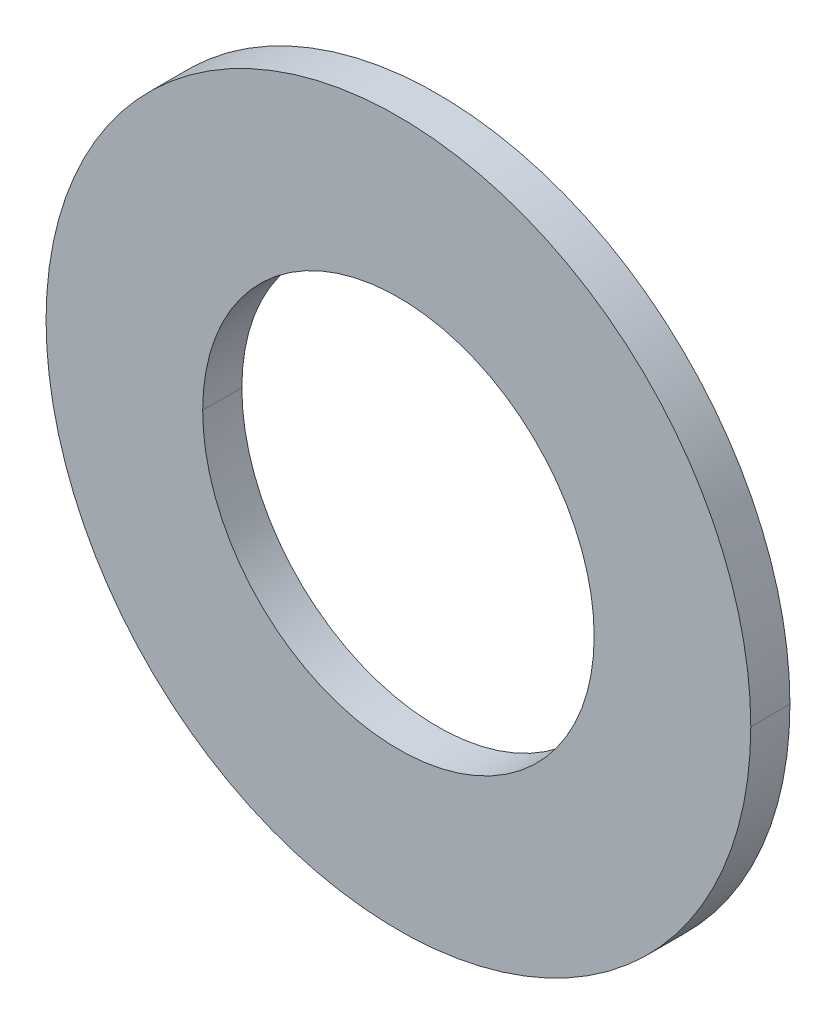
ISO-10303-21;
HEADER;
FILE_DESCRIPTION(('STEP AP214'),'2;1');
FILE_NAME('part.step','',(''),(''),'','','');
FILE_SCHEMA(('AUTOMOTIVE_DESIGN { 1 0 10303 214 1 1 1 1 }'));
ENDSEC;
DATA;
#1=APPLICATION_CONTEXT('core data for automotive mechanical design processes');
#2=APPLICATION_PROTOCOL_DEFINITION('international standard','automotive_design',2000,#1);
#3=PRODUCT_CONTEXT('',#1,'mechanical');
#4=PRODUCT('Part','Part','',(#3));
#5=PRODUCT_RELATED_PRODUCT_CATEGORY('part','',(#4));
#6=PRODUCT_DEFINITION_FORMATION('','',#4);
#7=PRODUCT_DEFINITION_CONTEXT('part definition',#1,'design');
#8=PRODUCT_DEFINITION('design','',#6,#7);
#9=PRODUCT_DEFINITION_SHAPE('','',#8);
#10=(LENGTH_UNIT() NAMED_UNIT(*) SI_UNIT(.MILLI.,.METRE.));
#11=(NAMED_UNIT(*) PLANE_ANGLE_UNIT() SI_UNIT($,.RADIAN.));
#12=(NAMED_UNIT(*) SI_UNIT($,.STERADIAN.) SOLID_ANGLE_UNIT());
#13=UNCERTAINTY_MEASURE_WITH_UNIT(LENGTH_MEASURE(1.E-05),#10,'distance_accuracy_value','');
#14=(GEOMETRIC_REPRESENTATION_CONTEXT(3) GLOBAL_UNCERTAINTY_ASSIGNED_CONTEXT((#13)) GLOBAL_UNIT_ASSIGNED_CONTEXT((#10,
#11,#12)) REPRESENTATION_CONTEXT('',''));
#15=CARTESIAN_POINT('',(0.,0.,0.));
#16=DIRECTION('',(0.,0.,1.));
#17=DIRECTION('',(1.,0.,0.));
#18=AXIS2_PLACEMENT_3D('',#15,#16,#17);
#19=CARTESIAN_POINT('',(0.,0.,0.25));
#20=DIRECTION('',(0.,0.,-1.));
#21=DIRECTION('',(-1.,0.,0.));
#22=AXIS2_PLACEMENT_3D('',#19,#20,#21);
#23=CYLINDRICAL_SURFACE('',#22,2.5);
#24=CARTESIAN_POINT('',(0.,0.,0.25));
#25=DIRECTION('',(0.,0.,1.));
#26=DIRECTION('',(1.,0.,0.));
#27=AXIS2_PLACEMENT_3D('',#24,#25,#26);
#28=CIRCLE('',#27,2.5);
#29=CARTESIAN_POINT('',(-2.5,0.,0.25));
#30=VERTEX_POINT('',#29);
#31=CARTESIAN_POINT('',(2.5,0.,0.25));
#32=VERTEX_POINT('',#31);
#33=EDGE_CURVE('E11',#30,#32,#28,.T.);
#34=ORIENTED_EDGE('',*,*,#33,.T.);
#35=DIRECTION('',(0.,0.,-1.));
#36=VECTOR('',#35,1.);
#37=CARTESIAN_POINT('',(2.5,0.,0.25));
#38=LINE('',#37,#36);
#39=CARTESIAN_POINT('',(2.5,0.,-0.25));
#40=VERTEX_POINT('',#39);
#41=EDGE_CURVE('E28',#32,#40,#38,.T.);
#42=ORIENTED_EDGE('',*,*,#41,.T.);
#43=CARTESIAN_POINT('',(0.,0.,-0.25));
#44=DIRECTION('',(0.,0.,1.));
#45=DIRECTION('',(1.,0.,0.));
#46=AXIS2_PLACEMENT_3D('',#43,#44,#45);
#47=CIRCLE('',#46,2.5);
#48=CARTESIAN_POINT('',(-2.5,0.,-0.25));
#49=VERTEX_POINT('',#48);
#50=EDGE_CURVE('E21',#49,#40,#47,.T.);
#51=ORIENTED_EDGE('',*,*,#50,.F.);
#52=DIRECTION('',(0.,0.,-1.));
#53=VECTOR('',#52,1.);
#54=CARTESIAN_POINT('',(-2.5,0.,0.25));
#55=LINE('',#54,#53);
#56=EDGE_CURVE('E69',#30,#49,#55,.T.);
#57=ORIENTED_EDGE('',*,*,#56,.F.);
#58=EDGE_LOOP('',(#34,#42,#51,#57));
#59=FACE_BOUND('',#58,.T.);
#60=ADVANCED_FACE('F17',(#59),#23,.F.);
#61=CARTESIAN_POINT('',(0.,0.,0.25));
#62=DIRECTION('',(0.,0.,-1.));
#63=DIRECTION('',(-1.,0.,0.));
#64=AXIS2_PLACEMENT_3D('',#61,#62,#63);
#65=CYLINDRICAL_SURFACE('',#64,4.5);
#66=CARTESIAN_POINT('',(0.,0.,0.25));
#67=DIRECTION('',(0.,0.,1.));
#68=DIRECTION('',(1.,0.,0.));
#69=AXIS2_PLACEMENT_3D('',#66,#67,#68);
#70=CIRCLE('',#69,4.5);
#71=CARTESIAN_POINT('',(4.5,0.,0.25));
#72=VERTEX_POINT('',#71);
#73=CARTESIAN_POINT('',(-4.5,0.,0.25));
#74=VERTEX_POINT('',#73);
#75=EDGE_CURVE('E98',#72,#74,#70,.T.);
#76=ORIENTED_EDGE('',*,*,#75,.F.);
#77=DIRECTION('',(0.,0.,-1.));
#78=VECTOR('',#77,1.);
#79=CARTESIAN_POINT('',(4.5,0.,0.25));
#80=LINE('',#79,#78);
#81=CARTESIAN_POINT('',(4.5,0.,-0.25));
#82=VERTEX_POINT('',#81);
#83=EDGE_CURVE('E95',#72,#82,#80,.T.);
#84=ORIENTED_EDGE('',*,*,#83,.T.);
#85=CARTESIAN_POINT('',(0.,0.,-0.25));
#86=DIRECTION('',(0.,0.,1.));
#87=DIRECTION('',(1.,0.,0.));
#88=AXIS2_PLACEMENT_3D('',#85,#86,#87);
#89=CIRCLE('',#88,4.5);
#90=CARTESIAN_POINT('',(-4.5,0.,-0.25));
#91=VERTEX_POINT('',#90);
#92=EDGE_CURVE('E92',#82,#91,#89,.T.);
#93=ORIENTED_EDGE('',*,*,#92,.T.);
#94=DIRECTION('',(0.,0.,-1.));
#95=VECTOR('',#94,1.);
#96=CARTESIAN_POINT('',(-4.5,0.,0.25));
#97=LINE('',#96,#95);
#98=EDGE_CURVE('E86',#74,#91,#97,.T.);
#99=ORIENTED_EDGE('',*,*,#98,.F.);
#100=EDGE_LOOP('',(#76,#84,#93,#99));
#101=FACE_BOUND('',#100,.T.);
#102=ADVANCED_FACE('F115',(#101),#65,.T.);
#103=CARTESIAN_POINT('',(0.,0.,0.25));
#104=DIRECTION('',(0.,0.,1.));
#105=DIRECTION('',(1.,0.,0.));
#106=AXIS2_PLACEMENT_3D('',#103,#104,#105);
#107=PLANE('',#106);
#108=CARTESIAN_POINT('',(0.,0.,0.25));
#109=DIRECTION('',(0.,0.,1.));
#110=DIRECTION('',(1.,0.,0.));
#111=AXIS2_PLACEMENT_3D('',#108,#109,#110);
#112=CIRCLE('',#111,4.5);
#113=EDGE_CURVE('E96',#74,#72,#112,.T.);
#114=ORIENTED_EDGE('',*,*,#113,.T.);
#115=ORIENTED_EDGE('',*,*,#75,.T.);
#116=EDGE_LOOP('',(#114,#115));
#117=FACE_BOUND('',#116,.T.);
#118=ORIENTED_EDGE('',*,*,#33,.F.);
#119=CARTESIAN_POINT('',(0.,0.,0.25));
#120=DIRECTION('',(0.,0.,1.));
#121=DIRECTION('',(1.,0.,0.));
#122=AXIS2_PLACEMENT_3D('',#119,#120,#121);
#123=CIRCLE('',#122,2.5);
#124=EDGE_CURVE('E74',#32,#30,#123,.T.);
#125=ORIENTED_EDGE('',*,*,#124,.F.);
#126=EDGE_LOOP('',(#118,#125));
#127=FACE_BOUND('',#126,.T.);
#128=ADVANCED_FACE('F77',(#117,#127),#107,.T.);
#129=CARTESIAN_POINT('',(0.,0.,-0.25));
#130=DIRECTION('',(0.,0.,1.));
#131=DIRECTION('',(1.,0.,0.));
#132=AXIS2_PLACEMENT_3D('',#129,#130,#131);
#133=PLANE('',#132);
#134=CARTESIAN_POINT('',(0.,0.,-0.25));
#135=DIRECTION('',(0.,0.,1.));
#136=DIRECTION('',(1.,0.,0.));
#137=AXIS2_PLACEMENT_3D('',#134,#135,#136);
#138=CIRCLE('',#137,4.5);
#139=EDGE_CURVE('E80',#91,#82,#138,.T.);
#140=ORIENTED_EDGE('',*,*,#139,.F.);
#141=ORIENTED_EDGE('',*,*,#92,.F.);
#142=EDGE_LOOP('',(#140,#141));
#143=FACE_BOUND('',#142,.T.);
#144=ORIENTED_EDGE('',*,*,#50,.T.);
#145=CARTESIAN_POINT('',(0.,0.,-0.25));
#146=DIRECTION('',(0.,0.,1.));
#147=DIRECTION('',(1.,0.,0.));
#148=AXIS2_PLACEMENT_3D('',#145,#146,#147);
#149=CIRCLE('',#148,2.5);
#150=EDGE_CURVE('E89',#40,#49,#149,.T.);
#151=ORIENTED_EDGE('',*,*,#150,.T.);
#152=EDGE_LOOP('',(#144,#151));
#153=FACE_BOUND('',#152,.T.);
#154=ADVANCED_FACE('F121',(#143,#153),#133,.F.);
#155=CARTESIAN_POINT('',(0.,0.,0.25));
#156=DIRECTION('',(0.,0.,-1.));
#157=DIRECTION('',(-1.,0.,0.));
#158=AXIS2_PLACEMENT_3D('',#155,#156,#157);
#159=CYLINDRICAL_SURFACE('',#158,4.5);
#160=ORIENTED_EDGE('',*,*,#83,.F.);
#161=ORIENTED_EDGE('',*,*,#113,.F.);
#162=ORIENTED_EDGE('',*,*,#98,.T.);
#163=ORIENTED_EDGE('',*,*,#139,.T.);
#164=EDGE_LOOP('',(#160,#161,#162,#163));
#165=FACE_BOUND('',#164,.T.);
#166=ADVANCED_FACE('F19',(#165),#159,.T.);
#167=CARTESIAN_POINT('',(0.,0.,0.25));
#168=DIRECTION('',(0.,0.,-1.));
#169=DIRECTION('',(-1.,0.,0.));
#170=AXIS2_PLACEMENT_3D('',#167,#168,#169);
#171=CYLINDRICAL_SURFACE('',#170,2.5);
#172=ORIENTED_EDGE('',*,*,#41,.F.);
#173=ORIENTED_EDGE('',*,*,#124,.T.);
#174=ORIENTED_EDGE('',*,*,#56,.T.);
#175=ORIENTED_EDGE('',*,*,#150,.F.);
#176=EDGE_LOOP('',(#172,#173,#174,#175));
#177=FACE_BOUND('',#176,.T.);
#178=ADVANCED_FACE('F78',(#177),#171,.F.);
#179=CLOSED_SHELL('',(#60,#102,#128,#154,#166,#178));
#180=MANIFOLD_SOLID_BREP('B1',#179);
#181=ADVANCED_BREP_SHAPE_REPRESENTATION('',(#18,#180),#14);
#182=SHAPE_DEFINITION_REPRESENTATION(#9,#181);
ENDSEC;
END-ISO-10303-21;
